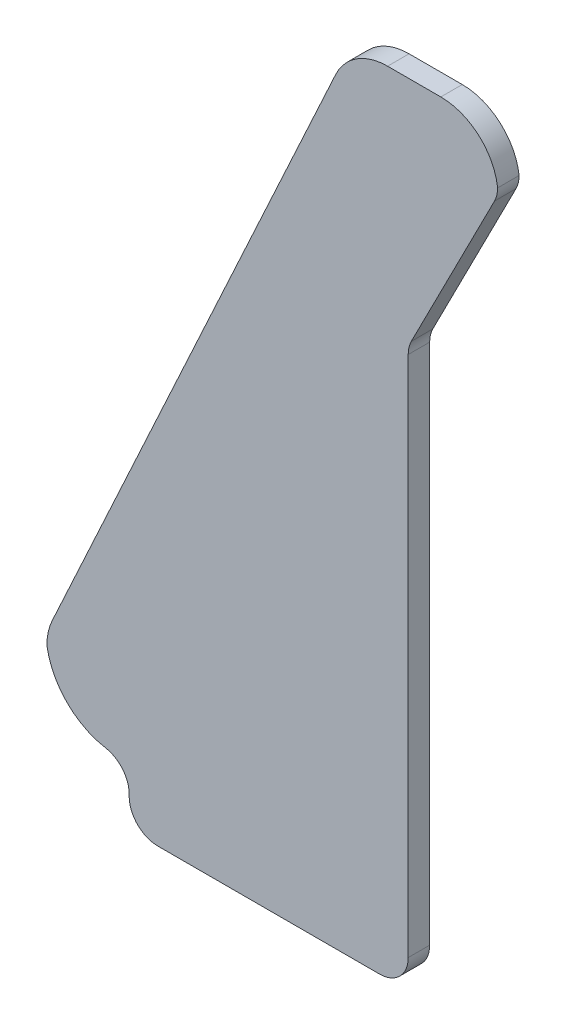
ISO-10303-21;
HEADER;
FILE_DESCRIPTION(('STEP AP214'),'2;1');
FILE_NAME('part.step','',(''),(''),'','','');
FILE_SCHEMA(('AUTOMOTIVE_DESIGN { 1 0 10303 214 1 1 1 1 }'));
ENDSEC;
DATA;
#1=APPLICATION_CONTEXT('core data for automotive mechanical design processes');
#2=APPLICATION_PROTOCOL_DEFINITION('international standard','automotive_design',2000,#1);
#3=PRODUCT_CONTEXT('',#1,'mechanical');
#4=PRODUCT('Part','Part','',(#3));
#5=PRODUCT_RELATED_PRODUCT_CATEGORY('part','',(#4));
#6=PRODUCT_DEFINITION_FORMATION('','',#4);
#7=PRODUCT_DEFINITION_CONTEXT('part definition',#1,'design');
#8=PRODUCT_DEFINITION('design','',#6,#7);
#9=PRODUCT_DEFINITION_SHAPE('','',#8);
#10=(LENGTH_UNIT() NAMED_UNIT(*) SI_UNIT(.MILLI.,.METRE.));
#11=(NAMED_UNIT(*) PLANE_ANGLE_UNIT() SI_UNIT($,.RADIAN.));
#12=(NAMED_UNIT(*) SI_UNIT($,.STERADIAN.) SOLID_ANGLE_UNIT());
#13=UNCERTAINTY_MEASURE_WITH_UNIT(LENGTH_MEASURE(1.E-05),#10,'distance_accuracy_value','');
#14=(GEOMETRIC_REPRESENTATION_CONTEXT(3) GLOBAL_UNCERTAINTY_ASSIGNED_CONTEXT((#13)) GLOBAL_UNIT_ASSIGNED_CONTEXT((#10,
#11,#12)) REPRESENTATION_CONTEXT('',''));
#15=CARTESIAN_POINT('',(0.,0.,0.));
#16=DIRECTION('',(0.,0.,1.));
#17=DIRECTION('',(1.,0.,0.));
#18=AXIS2_PLACEMENT_3D('',#15,#16,#17);
#19=CARTESIAN_POINT('',(39.476343731793,14.9981129646497,3.));
#20=DIRECTION('',(0.,0.,-1.));
#21=DIRECTION('',(-1.,0.,0.));
#22=AXIS2_PLACEMENT_3D('',#19,#20,#21);
#23=CYLINDRICAL_SURFACE('',#22,4.);
#24=CARTESIAN_POINT('',(39.476343731793,14.9981129646497,0.));
#25=DIRECTION('',(0.,0.,1.));
#26=DIRECTION('',(-1.,0.,0.));
#27=AXIS2_PLACEMENT_3D('',#24,#25,#26);
#28=CIRCLE('',#27,4.);
#29=CARTESIAN_POINT('',(43.039391210626,13.1802315978982,0.));
#30=VERTEX_POINT('',#29);
#31=CARTESIAN_POINT('',(43.476343731793,14.9981129646497,0.));
#32=VERTEX_POINT('',#31);
#33=EDGE_CURVE('E157',#30,#32,#28,.T.);
#34=ORIENTED_EDGE('',*,*,#33,.T.);
#35=DIRECTION('',(0.,0.,-1.));
#36=VECTOR('',#35,1.);
#37=CARTESIAN_POINT('',(43.476343731793,14.9981129646497,3.));
#38=LINE('',#37,#36);
#39=CARTESIAN_POINT('',(43.476343731793,14.9981129646497,3.));
#40=VERTEX_POINT('',#39);
#41=EDGE_CURVE('E155',#40,#32,#38,.T.);
#42=ORIENTED_EDGE('',*,*,#41,.F.);
#43=CARTESIAN_POINT('',(39.476343731793,14.9981129646497,3.));
#44=DIRECTION('',(0.,0.,1.));
#45=DIRECTION('',(-1.,0.,0.));
#46=AXIS2_PLACEMENT_3D('',#43,#44,#45);
#47=CIRCLE('',#46,4.);
#48=CARTESIAN_POINT('',(43.039391210626,13.1802315978982,3.));
#49=VERTEX_POINT('',#48);
#50=EDGE_CURVE('E142',#49,#40,#47,.T.);
#51=ORIENTED_EDGE('',*,*,#50,.F.);
#52=DIRECTION('',(0.,0.,-1.));
#53=VECTOR('',#52,1.);
#54=CARTESIAN_POINT('',(43.039391210626,13.1802315978982,3.));
#55=LINE('',#54,#53);
#56=EDGE_CURVE('E221',#49,#30,#55,.T.);
#57=ORIENTED_EDGE('',*,*,#56,.T.);
#58=EDGE_LOOP('',(#34,#42,#51,#57));
#59=FACE_BOUND('',#58,.T.);
#60=ADVANCED_FACE('F38',(#59),#23,.T.);
#61=CARTESIAN_POINT('',(28.0968215388898,22.0366585393857,3.));
#62=DIRECTION('',(0.,-1.,0.));
#63=DIRECTION('',(1.,0.,0.));
#64=AXIS2_PLACEMENT_3D('',#61,#62,#63);
#65=PLANE('',#64);
#66=DIRECTION('',(-1.,0.,0.));
#67=VECTOR('',#66,1.);
#68=CARTESIAN_POINT('',(28.0968215388898,22.0366585393857,3.));
#69=LINE('',#68,#67);
#70=CARTESIAN_POINT('',(35.534328534871,22.0366585393857,3.));
#71=VERTEX_POINT('',#70);
#72=CARTESIAN_POINT('',(28.0968215388898,22.0366585393857,3.));
#73=VERTEX_POINT('',#72);
#74=EDGE_CURVE('E151',#71,#73,#69,.T.);
#75=ORIENTED_EDGE('',*,*,#74,.F.);
#76=DIRECTION('',(0.,0.,-1.));
#77=VECTOR('',#76,1.);
#78=CARTESIAN_POINT('',(35.534328534871,22.0366585393857,3.));
#79=LINE('',#78,#77);
#80=CARTESIAN_POINT('',(35.534328534871,22.0366585393857,0.));
#81=VERTEX_POINT('',#80);
#82=EDGE_CURVE('E162',#71,#81,#79,.T.);
#83=ORIENTED_EDGE('',*,*,#82,.T.);
#84=DIRECTION('',(-1.,0.,0.));
#85=VECTOR('',#84,1.);
#86=CARTESIAN_POINT('',(28.0968215388898,22.0366585393857,0.));
#87=LINE('',#86,#85);
#88=CARTESIAN_POINT('',(28.0968215388898,22.0366585393857,0.));
#89=VERTEX_POINT('',#88);
#90=EDGE_CURVE('E257',#81,#89,#87,.T.);
#91=ORIENTED_EDGE('',*,*,#90,.T.);
#92=DIRECTION('',(0.,0.,-1.));
#93=VECTOR('',#92,1.);
#94=CARTESIAN_POINT('',(28.0968215388898,22.0366585393857,3.));
#95=LINE('',#94,#93);
#96=EDGE_CURVE('E160',#73,#89,#95,.T.);
#97=ORIENTED_EDGE('',*,*,#96,.F.);
#98=EDGE_LOOP('',(#75,#83,#91,#97));
#99=FACE_BOUND('',#98,.T.);
#100=ADVANCED_FACE('F298',(#99),#65,.F.);
#101=CARTESIAN_POINT('',(28.0968215388898,14.0366585393857,3.));
#102=DIRECTION('',(0.,0.,-1.));
#103=DIRECTION('',(-1.,0.,0.));
#104=AXIS2_PLACEMENT_3D('',#101,#102,#103);
#105=CYLINDRICAL_SURFACE('',#104,8.);
#106=CARTESIAN_POINT('',(28.0968215388898,14.0366585393857,0.));
#107=DIRECTION('',(0.,0.,1.));
#108=DIRECTION('',(-1.,0.,0.));
#109=AXIS2_PLACEMENT_3D('',#106,#107,#108);
#110=CIRCLE('',#109,8.);
#111=CARTESIAN_POINT('',(20.8320654350624,17.3867807389332,0.));
#112=VERTEX_POINT('',#111);
#113=EDGE_CURVE('E254',#89,#112,#110,.T.);
#114=ORIENTED_EDGE('',*,*,#113,.T.);
#115=DIRECTION('',(0.,0.,-1.));
#116=VECTOR('',#115,1.);
#117=CARTESIAN_POINT('',(20.8320654350624,17.3867807389332,3.));
#118=LINE('',#117,#116);
#119=CARTESIAN_POINT('',(20.8320654350624,17.3867807389332,3.));
#120=VERTEX_POINT('',#119);
#121=EDGE_CURVE('E181',#120,#112,#118,.T.);
#122=ORIENTED_EDGE('',*,*,#121,.F.);
#123=CARTESIAN_POINT('',(28.0968215388898,14.0366585393857,3.));
#124=DIRECTION('',(0.,0.,1.));
#125=DIRECTION('',(-1.,0.,0.));
#126=AXIS2_PLACEMENT_3D('',#123,#124,#125);
#127=CIRCLE('',#126,8.);
#128=EDGE_CURVE('E291',#73,#120,#127,.T.);
#129=ORIENTED_EDGE('',*,*,#128,.F.);
#130=ORIENTED_EDGE('',*,*,#96,.T.);
#131=EDGE_LOOP('',(#114,#122,#129,#130));
#132=FACE_BOUND('',#131,.T.);
#133=ADVANCED_FACE('F301',(#132),#105,.T.);
#134=CARTESIAN_POINT('',(-18.7884123720344,-68.5304159605005,3.));
#135=DIRECTION('',(0.908094512978435,-0.418765274943445,0.));
#136=DIRECTION('',(0.418765274943445,0.908094512978435,0.));
#137=AXIS2_PLACEMENT_3D('',#134,#135,#136);
#138=PLANE('',#137);
#139=DIRECTION('',(-0.418765274943445,-0.908094512978435,0.));
#140=VECTOR('',#139,1.);
#141=CARTESIAN_POINT('',(-18.7884123720344,-68.5304159605005,0.));
#142=LINE('',#141,#140);
#143=CARTESIAN_POINT('',(-18.7884123720344,-68.5304159605005,0.));
#144=VERTEX_POINT('',#143);
#145=EDGE_CURVE('E251',#112,#144,#142,.T.);
#146=ORIENTED_EDGE('',*,*,#145,.T.);
#147=DIRECTION('',(0.,0.,-1.));
#148=VECTOR('',#147,1.);
#149=CARTESIAN_POINT('',(-18.7884123720344,-68.5304159605005,3.));
#150=LINE('',#149,#148);
#151=CARTESIAN_POINT('',(-18.7884123720344,-68.5304159605005,3.));
#152=VERTEX_POINT('',#151);
#153=EDGE_CURVE('E185',#152,#144,#150,.T.);
#154=ORIENTED_EDGE('',*,*,#153,.F.);
#155=DIRECTION('',(-0.418765274943445,-0.908094512978435,0.));
#156=VECTOR('',#155,1.);
#157=CARTESIAN_POINT('',(-18.7884123720344,-68.5304159605005,3.));
#158=LINE('',#157,#156);
#159=EDGE_CURVE('E288',#120,#152,#158,.T.);
#160=ORIENTED_EDGE('',*,*,#159,.F.);
#161=ORIENTED_EDGE('',*,*,#121,.T.);
#162=EDGE_LOOP('',(#146,#154,#160,#161));
#163=FACE_BOUND('',#162,.T.);
#164=ADVANCED_FACE('F306',(#163),#138,.F.);
#165=CARTESIAN_POINT('',(-11.5236562682069,-71.8805381600481,3.));
#166=DIRECTION('',(0.,0.,-1.));
#167=DIRECTION('',(-1.,0.,0.));
#168=AXIS2_PLACEMENT_3D('',#165,#166,#167);
#169=CYLINDRICAL_SURFACE('',#168,8.);
#170=CARTESIAN_POINT('',(-11.5236562682069,-71.8805381600481,0.));
#171=DIRECTION('',(0.,0.,1.));
#172=DIRECTION('',(1.,0.,0.));
#173=AXIS2_PLACEMENT_3D('',#170,#171,#172);
#174=CIRCLE('',#173,8.);
#175=CARTESIAN_POINT('',(-19.5236562682069,-71.8805381600481,0.));
#176=VERTEX_POINT('',#175);
#177=EDGE_CURVE('E247',#144,#176,#174,.T.);
#178=ORIENTED_EDGE('',*,*,#177,.T.);
#179=DIRECTION('',(0.,0.,-1.));
#180=VECTOR('',#179,1.);
#181=CARTESIAN_POINT('',(-19.5236562682069,-71.8805381600481,3.));
#182=LINE('',#181,#180);
#183=CARTESIAN_POINT('',(-19.5236562682069,-71.8805381600481,3.));
#184=VERTEX_POINT('',#183);
#185=EDGE_CURVE('E189',#184,#176,#182,.T.);
#186=ORIENTED_EDGE('',*,*,#185,.F.);
#187=CARTESIAN_POINT('',(-11.5236562682069,-71.8805381600481,3.));
#188=DIRECTION('',(0.,0.,1.));
#189=DIRECTION('',(1.,0.,0.));
#190=AXIS2_PLACEMENT_3D('',#187,#188,#189);
#191=CIRCLE('',#190,8.);
#192=EDGE_CURVE('E285',#152,#184,#191,.T.);
#193=ORIENTED_EDGE('',*,*,#192,.F.);
#194=ORIENTED_EDGE('',*,*,#153,.T.);
#195=EDGE_LOOP('',(#178,#186,#193,#194));
#196=FACE_BOUND('',#195,.T.);
#197=ADVANCED_FACE('F312',(#196),#169,.T.);
#198=CARTESIAN_POINT('',(-12.0236562682069,-84.1247958858784,3.));
#199=DIRECTION('',(0.,0.,-1.));
#200=DIRECTION('',(-1.,0.,0.));
#201=AXIS2_PLACEMENT_3D('',#198,#199,#200);
#202=CYLINDRICAL_SURFACE('',#201,4.00000000000001);
#203=CARTESIAN_POINT('',(-12.0236562682069,-84.1247958858784,3.));
#204=DIRECTION('',(0.,0.,-1.));
#205=DIRECTION('',(1.,0.,0.));
#206=AXIS2_PLACEMENT_3D('',#203,#204,#205);
#207=CIRCLE('',#206,4.00000000000001);
#208=CARTESIAN_POINT('',(-11.3439977736796,-80.1829607382832,3.));
#209=VERTEX_POINT('',#208);
#210=CARTESIAN_POINT('',(-8.02365626820693,-84.1247958858784,3.));
#211=VERTEX_POINT('',#210);
#212=EDGE_CURVE('E282',#209,#211,#207,.T.);
#213=ORIENTED_EDGE('',*,*,#212,.F.);
#214=DIRECTION('',(0.,0.,-1.));
#215=VECTOR('',#214,1.);
#216=CARTESIAN_POINT('',(-11.3439977736796,-80.1829607382832,3.));
#217=LINE('',#216,#215);
#218=CARTESIAN_POINT('',(-11.3439977736796,-80.1829607382832,0.));
#219=VERTEX_POINT('',#218);
#220=EDGE_CURVE('E159',#209,#219,#217,.T.);
#221=ORIENTED_EDGE('',*,*,#220,.T.);
#222=CARTESIAN_POINT('',(-12.0236562682069,-84.1247958858784,0.));
#223=DIRECTION('',(0.,0.,-1.));
#224=DIRECTION('',(1.,0.,0.));
#225=AXIS2_PLACEMENT_3D('',#222,#223,#224);
#226=CIRCLE('',#225,4.00000000000001);
#227=CARTESIAN_POINT('',(-8.02365626820693,-84.1247958858784,0.));
#228=VERTEX_POINT('',#227);
#229=EDGE_CURVE('E244',#219,#228,#226,.T.);
#230=ORIENTED_EDGE('',*,*,#229,.T.);
#231=DIRECTION('',(0.,0.,-1.));
#232=VECTOR('',#231,1.);
#233=CARTESIAN_POINT('',(-8.02365626820693,-84.1247958858784,3.));
#234=LINE('',#233,#232);
#235=EDGE_CURVE('E193',#211,#228,#234,.T.);
#236=ORIENTED_EDGE('',*,*,#235,.F.);
#237=EDGE_LOOP('',(#213,#221,#230,#236));
#238=FACE_BOUND('',#237,.T.);
#239=ADVANCED_FACE('F319',(#238),#202,.F.);
#240=CARTESIAN_POINT('',(-8.02365626820694,-84.4247958858784,3.));
#241=DIRECTION('',(1.,0.,0.));
#242=DIRECTION('',(0.,0.,-1.));
#243=AXIS2_PLACEMENT_3D('',#240,#241,#242);
#244=PLANE('',#243);
#245=DIRECTION('',(0.,-1.,0.));
#246=VECTOR('',#245,1.);
#247=CARTESIAN_POINT('',(-8.02365626820694,-84.4247958858784,0.));
#248=LINE('',#247,#246);
#249=CARTESIAN_POINT('',(-8.02365626820694,-84.4247958858784,0.));
#250=VERTEX_POINT('',#249);
#251=EDGE_CURVE('E241',#228,#250,#248,.T.);
#252=ORIENTED_EDGE('',*,*,#251,.T.);
#253=DIRECTION('',(0.,0.,-1.));
#254=VECTOR('',#253,1.);
#255=CARTESIAN_POINT('',(-8.02365626820694,-84.4247958858784,3.));
#256=LINE('',#255,#254);
#257=CARTESIAN_POINT('',(-8.02365626820694,-84.4247958858784,3.));
#258=VERTEX_POINT('',#257);
#259=EDGE_CURVE('E197',#258,#250,#256,.T.);
#260=ORIENTED_EDGE('',*,*,#259,.F.);
#261=DIRECTION('',(0.,-1.,0.));
#262=VECTOR('',#261,1.);
#263=CARTESIAN_POINT('',(-8.02365626820694,-84.4247958858784,3.));
#264=LINE('',#263,#262);
#265=EDGE_CURVE('E279',#211,#258,#264,.T.);
#266=ORIENTED_EDGE('',*,*,#265,.F.);
#267=ORIENTED_EDGE('',*,*,#235,.T.);
#268=EDGE_LOOP('',(#252,#260,#266,#267));
#269=FACE_BOUND('',#268,.T.);
#270=ADVANCED_FACE('F328',(#269),#244,.F.);
#271=CARTESIAN_POINT('',(-4.02365626820694,-84.4247958858784,3.));
#272=DIRECTION('',(0.,0.,-1.));
#273=DIRECTION('',(-1.,0.,0.));
#274=AXIS2_PLACEMENT_3D('',#271,#272,#273);
#275=CYLINDRICAL_SURFACE('',#274,4.00000000000001);
#276=CARTESIAN_POINT('',(-4.02365626820694,-84.4247958858784,0.));
#277=DIRECTION('',(0.,0.,1.));
#278=DIRECTION('',(-1.,0.,0.));
#279=AXIS2_PLACEMENT_3D('',#276,#277,#278);
#280=CIRCLE('',#279,4.00000000000001);
#281=CARTESIAN_POINT('',(-4.02365626820694,-88.4247958858784,0.));
#282=VERTEX_POINT('',#281);
#283=EDGE_CURVE('E238',#250,#282,#280,.T.);
#284=ORIENTED_EDGE('',*,*,#283,.T.);
#285=DIRECTION('',(0.,0.,-1.));
#286=VECTOR('',#285,1.);
#287=CARTESIAN_POINT('',(-4.02365626820694,-88.4247958858784,3.));
#288=LINE('',#287,#286);
#289=CARTESIAN_POINT('',(-4.02365626820694,-88.4247958858784,3.));
#290=VERTEX_POINT('',#289);
#291=EDGE_CURVE('E201',#290,#282,#288,.T.);
#292=ORIENTED_EDGE('',*,*,#291,.F.);
#293=CARTESIAN_POINT('',(-4.02365626820694,-84.4247958858784,3.));
#294=DIRECTION('',(0.,0.,1.));
#295=DIRECTION('',(-1.,0.,0.));
#296=AXIS2_PLACEMENT_3D('',#293,#294,#295);
#297=CIRCLE('',#296,4.00000000000001);
#298=EDGE_CURVE('E276',#258,#290,#297,.T.);
#299=ORIENTED_EDGE('',*,*,#298,.F.);
#300=ORIENTED_EDGE('',*,*,#259,.T.);
#301=EDGE_LOOP('',(#284,#292,#299,#300));
#302=FACE_BOUND('',#301,.T.);
#303=ADVANCED_FACE('F332',(#302),#275,.T.);
#304=CARTESIAN_POINT('',(-4.02365626820694,-88.4247958858784,3.));
#305=DIRECTION('',(0.,1.,0.));
#306=DIRECTION('',(-1.,0.,0.));
#307=AXIS2_PLACEMENT_3D('',#304,#305,#306);
#308=PLANE('',#307);
#309=DIRECTION('',(1.,0.,0.));
#310=VECTOR('',#309,1.);
#311=CARTESIAN_POINT('',(-4.02365626820694,-88.4247958858784,0.));
#312=LINE('',#311,#310);
#313=CARTESIAN_POINT('',(26.9763437317931,-88.4247958858784,0.));
#314=VERTEX_POINT('',#313);
#315=EDGE_CURVE('E235',#282,#314,#312,.T.);
#316=ORIENTED_EDGE('',*,*,#315,.T.);
#317=DIRECTION('',(0.,0.,-1.));
#318=VECTOR('',#317,1.);
#319=CARTESIAN_POINT('',(26.9763437317931,-88.4247958858784,3.));
#320=LINE('',#319,#318);
#321=CARTESIAN_POINT('',(26.9763437317931,-88.4247958858784,3.));
#322=VERTEX_POINT('',#321);
#323=EDGE_CURVE('E205',#322,#314,#320,.T.);
#324=ORIENTED_EDGE('',*,*,#323,.F.);
#325=DIRECTION('',(1.,0.,0.));
#326=VECTOR('',#325,1.);
#327=CARTESIAN_POINT('',(-4.02365626820694,-88.4247958858784,3.));
#328=LINE('',#327,#326);
#329=EDGE_CURVE('E273',#290,#322,#328,.T.);
#330=ORIENTED_EDGE('',*,*,#329,.F.);
#331=ORIENTED_EDGE('',*,*,#291,.T.);
#332=EDGE_LOOP('',(#316,#324,#330,#331));
#333=FACE_BOUND('',#332,.T.);
#334=ADVANCED_FACE('F339',(#333),#308,.F.);
#335=CARTESIAN_POINT('',(26.9763437317931,-84.4247958858784,3.));
#336=DIRECTION('',(0.,0.,-1.));
#337=DIRECTION('',(-1.,0.,0.));
#338=AXIS2_PLACEMENT_3D('',#335,#336,#337);
#339=CYLINDRICAL_SURFACE('',#338,4.);
#340=CARTESIAN_POINT('',(26.9763437317931,-84.4247958858784,0.));
#341=DIRECTION('',(0.,0.,1.));
#342=DIRECTION('',(-1.,0.,0.));
#343=AXIS2_PLACEMENT_3D('',#340,#341,#342);
#344=CIRCLE('',#343,4.);
#345=CARTESIAN_POINT('',(30.9763437317931,-84.4247958858784,0.));
#346=VERTEX_POINT('',#345);
#347=EDGE_CURVE('E232',#314,#346,#344,.T.);
#348=ORIENTED_EDGE('',*,*,#347,.T.);
#349=DIRECTION('',(0.,0.,-1.));
#350=VECTOR('',#349,1.);
#351=CARTESIAN_POINT('',(30.9763437317931,-84.4247958858784,3.));
#352=LINE('',#351,#350);
#353=CARTESIAN_POINT('',(30.9763437317931,-84.4247958858784,3.));
#354=VERTEX_POINT('',#353);
#355=EDGE_CURVE('E209',#354,#346,#352,.T.);
#356=ORIENTED_EDGE('',*,*,#355,.F.);
#357=CARTESIAN_POINT('',(26.9763437317931,-84.4247958858784,3.));
#358=DIRECTION('',(0.,0.,1.));
#359=DIRECTION('',(-1.,0.,0.));
#360=AXIS2_PLACEMENT_3D('',#357,#358,#359);
#361=CIRCLE('',#360,4.);
#362=EDGE_CURVE('E270',#322,#354,#361,.T.);
#363=ORIENTED_EDGE('',*,*,#362,.F.);
#364=ORIENTED_EDGE('',*,*,#323,.T.);
#365=EDGE_LOOP('',(#348,#356,#363,#364));
#366=FACE_BOUND('',#365,.T.);
#367=ADVANCED_FACE('F342',(#366),#339,.T.);
#368=CARTESIAN_POINT('',(30.976343731793,-11.4247958858784,3.));
#369=DIRECTION('',(-1.,0.,0.));
#370=DIRECTION('',(0.,-1.,0.));
#371=AXIS2_PLACEMENT_3D('',#368,#369,#370);
#372=PLANE('',#371);
#373=DIRECTION('',(0.,1.,0.));
#374=VECTOR('',#373,1.);
#375=CARTESIAN_POINT('',(30.976343731793,-11.4247958858784,0.));
#376=LINE('',#375,#374);
#377=CARTESIAN_POINT('',(30.976343731793,-11.4247958858784,0.));
#378=VERTEX_POINT('',#377);
#379=EDGE_CURVE('E229',#346,#378,#376,.T.);
#380=ORIENTED_EDGE('',*,*,#379,.T.);
#381=DIRECTION('',(0.,0.,-1.));
#382=VECTOR('',#381,1.);
#383=CARTESIAN_POINT('',(30.976343731793,-11.4247958858784,3.));
#384=LINE('',#383,#382);
#385=CARTESIAN_POINT('',(30.976343731793,-11.4247958858784,3.));
#386=VERTEX_POINT('',#385);
#387=EDGE_CURVE('E213',#386,#378,#384,.T.);
#388=ORIENTED_EDGE('',*,*,#387,.F.);
#389=DIRECTION('',(0.,1.,0.));
#390=VECTOR('',#389,1.);
#391=CARTESIAN_POINT('',(30.976343731793,-11.4247958858784,3.));
#392=LINE('',#391,#390);
#393=EDGE_CURVE('E267',#354,#386,#392,.T.);
#394=ORIENTED_EDGE('',*,*,#393,.F.);
#395=ORIENTED_EDGE('',*,*,#355,.T.);
#396=EDGE_LOOP('',(#380,#388,#394,#395));
#397=FACE_BOUND('',#396,.T.);
#398=ADVANCED_FACE('F347',(#397),#372,.F.);
#399=CARTESIAN_POINT('',(34.9763437317931,-11.4247958858784,3.));
#400=DIRECTION('',(0.,0.,-1.));
#401=DIRECTION('',(-1.,0.,0.));
#402=AXIS2_PLACEMENT_3D('',#399,#400,#401);
#403=CYLINDRICAL_SURFACE('',#402,4.);
#404=CARTESIAN_POINT('',(34.9763437317931,-11.4247958858784,0.));
#405=DIRECTION('',(0.,0.,-1.));
#406=DIRECTION('',(1.,0.,0.));
#407=AXIS2_PLACEMENT_3D('',#404,#405,#406);
#408=CIRCLE('',#407,4.);
#409=CARTESIAN_POINT('',(31.4132962529601,-9.60691451912684,0.));
#410=VERTEX_POINT('',#409);
#411=EDGE_CURVE('E226',#378,#410,#408,.T.);
#412=ORIENTED_EDGE('',*,*,#411,.T.);
#413=DIRECTION('',(0.,0.,-1.));
#414=VECTOR('',#413,1.);
#415=CARTESIAN_POINT('',(31.4132962529601,-9.60691451912684,3.));
#416=LINE('',#415,#414);
#417=CARTESIAN_POINT('',(31.4132962529601,-9.60691451912684,3.));
#418=VERTEX_POINT('',#417);
#419=EDGE_CURVE('E217',#418,#410,#416,.T.);
#420=ORIENTED_EDGE('',*,*,#419,.F.);
#421=CARTESIAN_POINT('',(34.9763437317931,-11.4247958858784,3.));
#422=DIRECTION('',(0.,0.,-1.));
#423=DIRECTION('',(1.,0.,0.));
#424=AXIS2_PLACEMENT_3D('',#421,#422,#423);
#425=CIRCLE('',#424,4.);
#426=EDGE_CURVE('E264',#386,#418,#425,.T.);
#427=ORIENTED_EDGE('',*,*,#426,.F.);
#428=ORIENTED_EDGE('',*,*,#387,.T.);
#429=EDGE_LOOP('',(#412,#420,#427,#428));
#430=FACE_BOUND('',#429,.T.);
#431=ADVANCED_FACE('F351',(#430),#403,.F.);
#432=CARTESIAN_POINT('',(43.039391210626,13.1802315978982,3.));
#433=DIRECTION('',(-0.890761869708233,0.454470341687874,0.));
#434=DIRECTION('',(-0.454470341687874,-0.890761869708233,0.));
#435=AXIS2_PLACEMENT_3D('',#432,#433,#434);
#436=PLANE('',#435);
#437=DIRECTION('',(0.454470341687874,0.890761869708233,0.));
#438=VECTOR('',#437,1.);
#439=CARTESIAN_POINT('',(43.039391210626,13.1802315978982,0.));
#440=LINE('',#439,#438);
#441=EDGE_CURVE('E152',#410,#30,#440,.T.);
#442=ORIENTED_EDGE('',*,*,#441,.T.);
#443=ORIENTED_EDGE('',*,*,#56,.F.);
#444=DIRECTION('',(0.454470341687874,0.890761869708233,0.));
#445=VECTOR('',#444,1.);
#446=CARTESIAN_POINT('',(43.039391210626,13.1802315978982,3.));
#447=LINE('',#446,#445);
#448=EDGE_CURVE('E146',#418,#49,#447,.T.);
#449=ORIENTED_EDGE('',*,*,#448,.F.);
#450=ORIENTED_EDGE('',*,*,#419,.T.);
#451=EDGE_LOOP('',(#442,#443,#449,#450));
#452=FACE_BOUND('',#451,.T.);
#453=ADVANCED_FACE('F355',(#452),#436,.F.);
#454=CARTESIAN_POINT('',(39.476343731793,14.9981129646497,3.));
#455=DIRECTION('',(0.,0.,-1.));
#456=DIRECTION('',(-1.,0.,0.));
#457=AXIS2_PLACEMENT_3D('',#454,#455,#456);
#458=PLANE('',#457);
#459=ORIENTED_EDGE('',*,*,#50,.T.);
#460=CARTESIAN_POINT('',(35.534328534871,14.0366585393857,3.));
#461=DIRECTION('',(0.,0.,-1.));
#462=DIRECTION('',(-1.,0.,0.));
#463=AXIS2_PLACEMENT_3D('',#460,#461,#462);
#464=CIRCLE('',#463,8.);
#465=EDGE_CURVE('E11',#40,#71,#464,.F.);
#466=ORIENTED_EDGE('',*,*,#465,.T.);
#467=ORIENTED_EDGE('',*,*,#74,.T.);
#468=ORIENTED_EDGE('',*,*,#128,.T.);
#469=ORIENTED_EDGE('',*,*,#159,.T.);
#470=ORIENTED_EDGE('',*,*,#192,.T.);
#471=CARTESIAN_POINT('',(-9.64485153736111,-70.3283728692952,3.));
#472=DIRECTION('',(0.,0.,-1.));
#473=DIRECTION('',(-1.,0.,0.));
#474=AXIS2_PLACEMENT_3D('',#471,#472,#473);
#475=CIRCLE('',#474,10.);
#476=EDGE_CURVE('E166',#184,#209,#475,.F.);
#477=ORIENTED_EDGE('',*,*,#476,.T.);
#478=ORIENTED_EDGE('',*,*,#212,.T.);
#479=ORIENTED_EDGE('',*,*,#265,.T.);
#480=ORIENTED_EDGE('',*,*,#298,.T.);
#481=ORIENTED_EDGE('',*,*,#329,.T.);
#482=ORIENTED_EDGE('',*,*,#362,.T.);
#483=ORIENTED_EDGE('',*,*,#393,.T.);
#484=ORIENTED_EDGE('',*,*,#426,.T.);
#485=ORIENTED_EDGE('',*,*,#448,.T.);
#486=EDGE_LOOP('',(#459,#466,#467,#468,#469,#470,#477,#478,#479,#480,#481,#482,#483,#484,#485));
#487=FACE_BOUND('',#486,.T.);
#488=ADVANCED_FACE('F144',(#487),#458,.F.);
#489=CARTESIAN_POINT('',(39.476343731793,14.9981129646497,0.));
#490=DIRECTION('',(0.,0.,-1.));
#491=DIRECTION('',(-1.,0.,0.));
#492=AXIS2_PLACEMENT_3D('',#489,#490,#491);
#493=PLANE('',#492);
#494=ORIENTED_EDGE('',*,*,#90,.F.);
#495=CARTESIAN_POINT('',(35.534328534871,14.0366585393857,0.));
#496=DIRECTION('',(0.,0.,-1.));
#497=DIRECTION('',(-1.,0.,0.));
#498=AXIS2_PLACEMENT_3D('',#495,#496,#497);
#499=CIRCLE('',#498,8.);
#500=EDGE_CURVE('E47',#81,#32,#499,.T.);
#501=ORIENTED_EDGE('',*,*,#500,.T.);
#502=ORIENTED_EDGE('',*,*,#33,.F.);
#503=ORIENTED_EDGE('',*,*,#441,.F.);
#504=ORIENTED_EDGE('',*,*,#411,.F.);
#505=ORIENTED_EDGE('',*,*,#379,.F.);
#506=ORIENTED_EDGE('',*,*,#347,.F.);
#507=ORIENTED_EDGE('',*,*,#315,.F.);
#508=ORIENTED_EDGE('',*,*,#283,.F.);
#509=ORIENTED_EDGE('',*,*,#251,.F.);
#510=ORIENTED_EDGE('',*,*,#229,.F.);
#511=CARTESIAN_POINT('',(-9.64485153736111,-70.3283728692952,0.));
#512=DIRECTION('',(0.,0.,-1.));
#513=DIRECTION('',(-1.,0.,0.));
#514=AXIS2_PLACEMENT_3D('',#511,#512,#513);
#515=CIRCLE('',#514,10.);
#516=EDGE_CURVE('E170',#219,#176,#515,.T.);
#517=ORIENTED_EDGE('',*,*,#516,.T.);
#518=ORIENTED_EDGE('',*,*,#177,.F.);
#519=ORIENTED_EDGE('',*,*,#145,.F.);
#520=ORIENTED_EDGE('',*,*,#113,.F.);
#521=EDGE_LOOP('',(#494,#501,#502,#503,#504,#505,#506,#507,#508,#509,#510,#517,#518,#519,#520));
#522=FACE_BOUND('',#521,.T.);
#523=ADVANCED_FACE('F323',(#522),#493,.T.);
#524=CARTESIAN_POINT('',(-9.64485153736111,-70.3283728692952,3.));
#525=DIRECTION('',(0.,0.,-1.));
#526=DIRECTION('',(-1.,0.,0.));
#527=AXIS2_PLACEMENT_3D('',#524,#525,#526);
#528=CYLINDRICAL_SURFACE('',#527,10.);
#529=ORIENTED_EDGE('',*,*,#476,.F.);
#530=ORIENTED_EDGE('',*,*,#185,.T.);
#531=ORIENTED_EDGE('',*,*,#516,.F.);
#532=ORIENTED_EDGE('',*,*,#220,.F.);
#533=EDGE_LOOP('',(#529,#530,#531,#532));
#534=FACE_BOUND('',#533,.T.);
#535=ADVANCED_FACE('F316',(#534),#528,.T.);
#536=CARTESIAN_POINT('',(35.534328534871,14.0366585393857,3.));
#537=DIRECTION('',(0.,0.,-1.));
#538=DIRECTION('',(-1.,0.,0.));
#539=AXIS2_PLACEMENT_3D('',#536,#537,#538);
#540=CYLINDRICAL_SURFACE('',#539,8.);
#541=ORIENTED_EDGE('',*,*,#465,.F.);
#542=ORIENTED_EDGE('',*,*,#41,.T.);
#543=ORIENTED_EDGE('',*,*,#500,.F.);
#544=ORIENTED_EDGE('',*,*,#82,.F.);
#545=EDGE_LOOP('',(#541,#542,#543,#544));
#546=FACE_BOUND('',#545,.T.);
#547=ADVANCED_FACE('F40',(#546),#540,.T.);
#548=CLOSED_SHELL('',(#60,#100,#133,#164,#197,#239,#270,#303,#334,#367,#398,#431,#453,#488,#523,
#535,#547));
#549=MANIFOLD_SOLID_BREP('B2',#548);
#550=ADVANCED_BREP_SHAPE_REPRESENTATION('',(#18,#549),#14);
#551=SHAPE_DEFINITION_REPRESENTATION(#9,#550);
ENDSEC;
END-ISO-10303-21;
